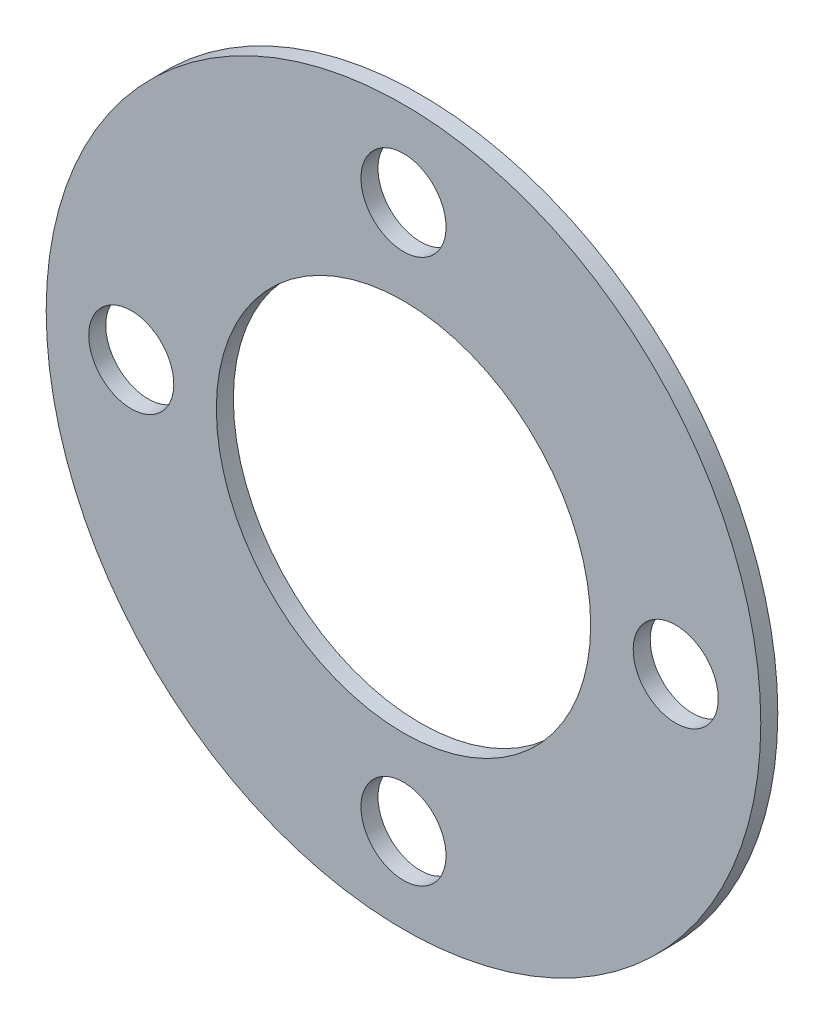
ISO-10303-21;
HEADER;
FILE_DESCRIPTION(('STEP AP214'),'2;1');
FILE_NAME('part.step','',(''),(''),'','','');
FILE_SCHEMA(('AUTOMOTIVE_DESIGN { 1 0 10303 214 1 1 1 1 }'));
ENDSEC;
DATA;
#1=APPLICATION_CONTEXT('core data for automotive mechanical design processes');
#2=APPLICATION_PROTOCOL_DEFINITION('international standard','automotive_design',2000,#1);
#3=PRODUCT_CONTEXT('',#1,'mechanical');
#4=PRODUCT('Part','Part','',(#3));
#5=PRODUCT_RELATED_PRODUCT_CATEGORY('part','',(#4));
#6=PRODUCT_DEFINITION_FORMATION('','',#4);
#7=PRODUCT_DEFINITION_CONTEXT('part definition',#1,'design');
#8=PRODUCT_DEFINITION('design','',#6,#7);
#9=PRODUCT_DEFINITION_SHAPE('','',#8);
#10=(LENGTH_UNIT() NAMED_UNIT(*) SI_UNIT(.MILLI.,.METRE.));
#11=(NAMED_UNIT(*) PLANE_ANGLE_UNIT() SI_UNIT($,.RADIAN.));
#12=(NAMED_UNIT(*) SI_UNIT($,.STERADIAN.) SOLID_ANGLE_UNIT());
#13=UNCERTAINTY_MEASURE_WITH_UNIT(LENGTH_MEASURE(1.E-05),#10,'distance_accuracy_value','');
#14=(GEOMETRIC_REPRESENTATION_CONTEXT(3) GLOBAL_UNCERTAINTY_ASSIGNED_CONTEXT((#13)) GLOBAL_UNIT_ASSIGNED_CONTEXT((#10,
#11,#12)) REPRESENTATION_CONTEXT('',''));
#15=CARTESIAN_POINT('',(0.,0.,0.));
#16=DIRECTION('',(0.,0.,1.));
#17=DIRECTION('',(1.,0.,0.));
#18=AXIS2_PLACEMENT_3D('',#15,#16,#17);
#19=CARTESIAN_POINT('',(0.,0.,1.));
#20=DIRECTION('',(0.,0.,1.));
#21=DIRECTION('',(1.,0.,0.));
#22=AXIS2_PLACEMENT_3D('',#19,#20,#21);
#23=PLANE('',#22);
#24=CARTESIAN_POINT('',(-16.,1.6623582219923E-13,1.));
#25=DIRECTION('',(0.,0.,1.));
#26=DIRECTION('',(0.,1.,0.));
#27=AXIS2_PLACEMENT_3D('',#24,#25,#26);
#28=CIRCLE('',#27,2.5);
#29=CARTESIAN_POINT('',(-16.,2.50000000000017,1.));
#30=VERTEX_POINT('',#29);
#31=EDGE_CURVE('E80',#30,#30,#28,.T.);
#32=ORIENTED_EDGE('',*,*,#31,.F.);
#33=EDGE_LOOP('',(#32));
#34=FACE_BOUND('',#33,.T.);
#35=CARTESIAN_POINT('',(0.,-16.,1.));
#36=DIRECTION('',(0.,0.,1.));
#37=DIRECTION('',(-1.,0.,0.));
#38=AXIS2_PLACEMENT_3D('',#35,#36,#37);
#39=CIRCLE('',#38,2.5);
#40=CARTESIAN_POINT('',(-2.5,-16.,1.));
#41=VERTEX_POINT('',#40);
#42=EDGE_CURVE('E74',#41,#41,#39,.T.);
#43=ORIENTED_EDGE('',*,*,#42,.F.);
#44=EDGE_LOOP('',(#43));
#45=FACE_BOUND('',#44,.T.);
#46=CARTESIAN_POINT('',(16.,0.,1.));
#47=DIRECTION('',(0.,0.,1.));
#48=DIRECTION('',(0.,-1.,0.));
#49=AXIS2_PLACEMENT_3D('',#46,#47,#48);
#50=CIRCLE('',#49,2.5);
#51=CARTESIAN_POINT('',(16.,-2.50000000000006,1.));
#52=VERTEX_POINT('',#51);
#53=EDGE_CURVE('E66',#52,#52,#50,.T.);
#54=ORIENTED_EDGE('',*,*,#53,.F.);
#55=EDGE_LOOP('',(#54));
#56=FACE_BOUND('',#55,.T.);
#57=CARTESIAN_POINT('',(0.,16.,1.));
#58=DIRECTION('',(0.,0.,1.));
#59=DIRECTION('',(1.,0.,0.));
#60=AXIS2_PLACEMENT_3D('',#57,#58,#59);
#61=CIRCLE('',#60,2.5);
#62=CARTESIAN_POINT('',(2.5,16.,1.));
#63=VERTEX_POINT('',#62);
#64=EDGE_CURVE('E63',#63,#63,#61,.T.);
#65=ORIENTED_EDGE('',*,*,#64,.F.);
#66=EDGE_LOOP('',(#65));
#67=FACE_BOUND('',#66,.T.);
#68=CARTESIAN_POINT('',(0.,0.,1.));
#69=DIRECTION('',(0.,0.,1.));
#70=DIRECTION('',(1.,0.,0.));
#71=AXIS2_PLACEMENT_3D('',#68,#69,#70);
#72=CIRCLE('',#71,21.);
#73=CARTESIAN_POINT('',(21.,0.,1.));
#74=VERTEX_POINT('',#73);
#75=EDGE_CURVE('E12',#74,#74,#72,.T.);
#76=ORIENTED_EDGE('',*,*,#75,.T.);
#77=EDGE_LOOP('',(#76));
#78=FACE_BOUND('',#77,.T.);
#79=CARTESIAN_POINT('',(0.,0.,1.));
#80=DIRECTION('',(0.,0.,1.));
#81=DIRECTION('',(1.,0.,0.));
#82=AXIS2_PLACEMENT_3D('',#79,#80,#81);
#83=CIRCLE('',#82,11.);
#84=CARTESIAN_POINT('',(11.,0.,1.));
#85=VERTEX_POINT('',#84);
#86=EDGE_CURVE('E55',#85,#85,#83,.T.);
#87=ORIENTED_EDGE('',*,*,#86,.F.);
#88=EDGE_LOOP('',(#87));
#89=FACE_BOUND('',#88,.T.);
#90=ADVANCED_FACE('F44',(#34,#45,#56,#67,#78,#89),#23,.T.);
#91=CARTESIAN_POINT('',(0.,0.,0.));
#92=DIRECTION('',(0.,0.,1.));
#93=DIRECTION('',(1.,0.,0.));
#94=AXIS2_PLACEMENT_3D('',#91,#92,#93);
#95=PLANE('',#94);
#96=CARTESIAN_POINT('',(-16.,1.6623582219923E-13,0.));
#97=DIRECTION('',(0.,0.,1.));
#98=DIRECTION('',(0.,1.,0.));
#99=AXIS2_PLACEMENT_3D('',#96,#97,#98);
#100=CIRCLE('',#99,2.5);
#101=CARTESIAN_POINT('',(-16.,2.50000000000017,0.));
#102=VERTEX_POINT('',#101);
#103=EDGE_CURVE('E83',#102,#102,#100,.T.);
#104=ORIENTED_EDGE('',*,*,#103,.T.);
#105=EDGE_LOOP('',(#104));
#106=FACE_BOUND('',#105,.T.);
#107=CARTESIAN_POINT('',(0.,-16.,0.));
#108=DIRECTION('',(0.,0.,1.));
#109=DIRECTION('',(-1.,0.,0.));
#110=AXIS2_PLACEMENT_3D('',#107,#108,#109);
#111=CIRCLE('',#110,2.5);
#112=CARTESIAN_POINT('',(-2.5,-16.,0.));
#113=VERTEX_POINT('',#112);
#114=EDGE_CURVE('E77',#113,#113,#111,.T.);
#115=ORIENTED_EDGE('',*,*,#114,.T.);
#116=EDGE_LOOP('',(#115));
#117=FACE_BOUND('',#116,.T.);
#118=CARTESIAN_POINT('',(16.,0.,0.));
#119=DIRECTION('',(0.,0.,1.));
#120=DIRECTION('',(0.,-1.,0.));
#121=AXIS2_PLACEMENT_3D('',#118,#119,#120);
#122=CIRCLE('',#121,2.5);
#123=CARTESIAN_POINT('',(16.,-2.50000000000006,0.));
#124=VERTEX_POINT('',#123);
#125=EDGE_CURVE('E71',#124,#124,#122,.T.);
#126=ORIENTED_EDGE('',*,*,#125,.T.);
#127=EDGE_LOOP('',(#126));
#128=FACE_BOUND('',#127,.T.);
#129=CARTESIAN_POINT('',(0.,16.,0.));
#130=DIRECTION('',(0.,0.,1.));
#131=DIRECTION('',(1.,0.,0.));
#132=AXIS2_PLACEMENT_3D('',#129,#130,#131);
#133=CIRCLE('',#132,2.5);
#134=CARTESIAN_POINT('',(2.5,16.,0.));
#135=VERTEX_POINT('',#134);
#136=EDGE_CURVE('E60',#135,#135,#133,.T.);
#137=ORIENTED_EDGE('',*,*,#136,.T.);
#138=EDGE_LOOP('',(#137));
#139=FACE_BOUND('',#138,.T.);
#140=CARTESIAN_POINT('',(0.,0.,0.));
#141=DIRECTION('',(0.,0.,1.));
#142=DIRECTION('',(1.,0.,0.));
#143=AXIS2_PLACEMENT_3D('',#140,#141,#142);
#144=CIRCLE('',#143,21.);
#145=CARTESIAN_POINT('',(21.,0.,0.));
#146=VERTEX_POINT('',#145);
#147=EDGE_CURVE('E48',#146,#146,#144,.T.);
#148=ORIENTED_EDGE('',*,*,#147,.F.);
#149=EDGE_LOOP('',(#148));
#150=FACE_BOUND('',#149,.T.);
#151=CARTESIAN_POINT('',(0.,0.,0.));
#152=DIRECTION('',(0.,0.,1.));
#153=DIRECTION('',(1.,0.,0.));
#154=AXIS2_PLACEMENT_3D('',#151,#152,#153);
#155=CIRCLE('',#154,11.);
#156=CARTESIAN_POINT('',(11.,0.,0.));
#157=VERTEX_POINT('',#156);
#158=EDGE_CURVE('E57',#157,#157,#155,.T.);
#159=ORIENTED_EDGE('',*,*,#158,.T.);
#160=EDGE_LOOP('',(#159));
#161=FACE_BOUND('',#160,.T.);
#162=ADVANCED_FACE('F87',(#106,#117,#128,#139,#150,#161),#95,.F.);
#163=CARTESIAN_POINT('',(0.,0.,1.));
#164=DIRECTION('',(0.,0.,-1.));
#165=DIRECTION('',(-1.,0.,0.));
#166=AXIS2_PLACEMENT_3D('',#163,#164,#165);
#167=CYLINDRICAL_SURFACE('',#166,21.);
#168=ORIENTED_EDGE('',*,*,#75,.F.);
#169=EDGE_LOOP('',(#168));
#170=FACE_BOUND('',#169,.T.);
#171=ORIENTED_EDGE('',*,*,#147,.T.);
#172=EDGE_LOOP('',(#171));
#173=FACE_BOUND('',#172,.T.);
#174=ADVANCED_FACE('F46',(#170,#173),#167,.T.);
#175=CARTESIAN_POINT('',(0.,0.,1.));
#176=DIRECTION('',(0.,0.,-1.));
#177=DIRECTION('',(-1.,0.,0.));
#178=AXIS2_PLACEMENT_3D('',#175,#176,#177);
#179=CYLINDRICAL_SURFACE('',#178,11.);
#180=ORIENTED_EDGE('',*,*,#86,.T.);
#181=EDGE_LOOP('',(#180));
#182=FACE_BOUND('',#181,.T.);
#183=ORIENTED_EDGE('',*,*,#158,.F.);
#184=EDGE_LOOP('',(#183));
#185=FACE_BOUND('',#184,.T.);
#186=ADVANCED_FACE('F108',(#182,#185),#179,.F.);
#187=CARTESIAN_POINT('',(0.,16.,0.));
#188=DIRECTION('',(0.,0.,1.));
#189=DIRECTION('',(1.,0.,0.));
#190=AXIS2_PLACEMENT_3D('',#187,#188,#189);
#191=CYLINDRICAL_SURFACE('',#190,2.5);
#192=ORIENTED_EDGE('',*,*,#136,.F.);
#193=EDGE_LOOP('',(#192));
#194=FACE_BOUND('',#193,.T.);
#195=ORIENTED_EDGE('',*,*,#64,.T.);
#196=EDGE_LOOP('',(#195));
#197=FACE_BOUND('',#196,.T.);
#198=ADVANCED_FACE('F111',(#194,#197),#191,.F.);
#199=CARTESIAN_POINT('',(16.,0.,0.));
#200=DIRECTION('',(0.,0.,1.));
#201=DIRECTION('',(0.,-1.,0.));
#202=AXIS2_PLACEMENT_3D('',#199,#200,#201);
#203=CYLINDRICAL_SURFACE('',#202,2.5);
#204=ORIENTED_EDGE('',*,*,#125,.F.);
#205=EDGE_LOOP('',(#204));
#206=FACE_BOUND('',#205,.T.);
#207=ORIENTED_EDGE('',*,*,#53,.T.);
#208=EDGE_LOOP('',(#207));
#209=FACE_BOUND('',#208,.T.);
#210=ADVANCED_FACE('F123',(#206,#209),#203,.F.);
#211=CARTESIAN_POINT('',(0.,-16.,0.));
#212=DIRECTION('',(0.,0.,1.));
#213=DIRECTION('',(-1.,0.,0.));
#214=AXIS2_PLACEMENT_3D('',#211,#212,#213);
#215=CYLINDRICAL_SURFACE('',#214,2.5);
#216=ORIENTED_EDGE('',*,*,#114,.F.);
#217=EDGE_LOOP('',(#216));
#218=FACE_BOUND('',#217,.T.);
#219=ORIENTED_EDGE('',*,*,#42,.T.);
#220=EDGE_LOOP('',(#219));
#221=FACE_BOUND('',#220,.T.);
#222=ADVANCED_FACE('F93',(#218,#221),#215,.F.);
#223=CARTESIAN_POINT('',(-16.,1.6623582219923E-13,0.));
#224=DIRECTION('',(0.,0.,1.));
#225=DIRECTION('',(0.,1.,0.));
#226=AXIS2_PLACEMENT_3D('',#223,#224,#225);
#227=CYLINDRICAL_SURFACE('',#226,2.5);
#228=ORIENTED_EDGE('',*,*,#103,.F.);
#229=EDGE_LOOP('',(#228));
#230=FACE_BOUND('',#229,.T.);
#231=ORIENTED_EDGE('',*,*,#31,.T.);
#232=EDGE_LOOP('',(#231));
#233=FACE_BOUND('',#232,.T.);
#234=ADVANCED_FACE('F90',(#230,#233),#227,.F.);
#235=CLOSED_SHELL('',(#90,#162,#174,#186,#198,#210,#222,#234));
#236=MANIFOLD_SOLID_BREP('B2',#235);
#237=ADVANCED_BREP_SHAPE_REPRESENTATION('',(#18,#236),#14);
#238=SHAPE_DEFINITION_REPRESENTATION(#9,#237);
ENDSEC;
END-ISO-10303-21;
